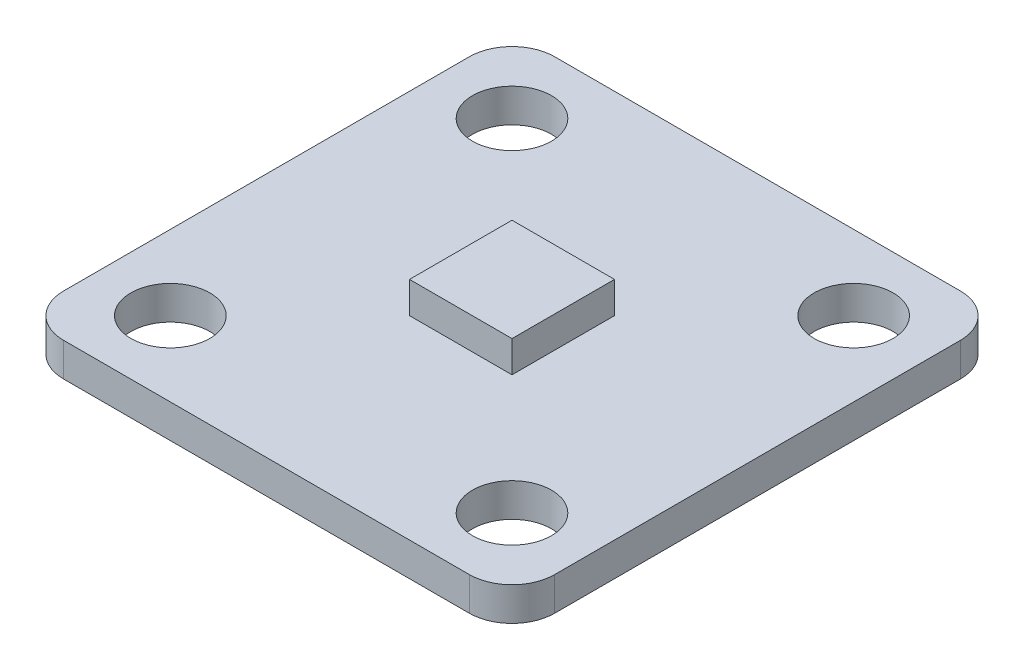
ISO-10303-21;
HEADER;
FILE_DESCRIPTION(('STEP AP214'),'2;1');
FILE_NAME('part.step','',(''),(''),'','','');
FILE_SCHEMA(('AUTOMOTIVE_DESIGN { 1 0 10303 214 1 1 1 1 }'));
ENDSEC;
DATA;
#1=APPLICATION_CONTEXT('core data for automotive mechanical design processes');
#2=APPLICATION_PROTOCOL_DEFINITION('international standard','automotive_design',2000,#1);
#3=PRODUCT_CONTEXT('',#1,'mechanical');
#4=PRODUCT('Part','Part','',(#3));
#5=PRODUCT_RELATED_PRODUCT_CATEGORY('part','',(#4));
#6=PRODUCT_DEFINITION_FORMATION('','',#4);
#7=PRODUCT_DEFINITION_CONTEXT('part definition',#1,'design');
#8=PRODUCT_DEFINITION('design','',#6,#7);
#9=PRODUCT_DEFINITION_SHAPE('','',#8);
#10=(LENGTH_UNIT() NAMED_UNIT(*) SI_UNIT(.MILLI.,.METRE.));
#11=(NAMED_UNIT(*) PLANE_ANGLE_UNIT() SI_UNIT($,.RADIAN.));
#12=(NAMED_UNIT(*) SI_UNIT($,.STERADIAN.) SOLID_ANGLE_UNIT());
#13=UNCERTAINTY_MEASURE_WITH_UNIT(LENGTH_MEASURE(1.E-05),#10,'distance_accuracy_value','');
#14=(GEOMETRIC_REPRESENTATION_CONTEXT(3) GLOBAL_UNCERTAINTY_ASSIGNED_CONTEXT((#13)) GLOBAL_UNIT_ASSIGNED_CONTEXT((#10,
#11,#12)) REPRESENTATION_CONTEXT('',''));
#15=CARTESIAN_POINT('',(0.,0.,0.));
#16=DIRECTION('',(0.,0.,1.));
#17=DIRECTION('',(1.,0.,0.));
#18=AXIS2_PLACEMENT_3D('',#15,#16,#17);
#19=CARTESIAN_POINT('',(0.,1.57,0.));
#20=DIRECTION('',(0.,1.,0.));
#21=DIRECTION('',(0.,0.,1.));
#22=AXIS2_PLACEMENT_3D('',#19,#20,#21);
#23=PLANE('',#22);
#24=CARTESIAN_POINT('',(-8.,1.57,8.));
#25=DIRECTION('',(0.,1.,0.));
#26=DIRECTION('',(0.,0.,1.));
#27=AXIS2_PLACEMENT_3D('',#24,#25,#26);
#28=CIRCLE('',#27,1.85);
#29=CARTESIAN_POINT('',(-8.,1.57,9.85));
#30=VERTEX_POINT('',#29);
#31=EDGE_CURVE('E179',#30,#30,#28,.T.);
#32=ORIENTED_EDGE('',*,*,#31,.F.);
#33=EDGE_LOOP('',(#32));
#34=FACE_BOUND('',#33,.T.);
#35=CARTESIAN_POINT('',(8.,1.57,8.));
#36=DIRECTION('',(0.,1.,0.));
#37=DIRECTION('',(0.,0.,1.));
#38=AXIS2_PLACEMENT_3D('',#35,#36,#37);
#39=CIRCLE('',#38,1.85);
#40=CARTESIAN_POINT('',(8.,1.57,9.85));
#41=VERTEX_POINT('',#40);
#42=EDGE_CURVE('E219',#41,#41,#39,.T.);
#43=ORIENTED_EDGE('',*,*,#42,.F.);
#44=EDGE_LOOP('',(#43));
#45=FACE_BOUND('',#44,.T.);
#46=CARTESIAN_POINT('',(8.,1.57,-8.));
#47=DIRECTION('',(0.,1.,0.));
#48=DIRECTION('',(0.,0.,1.));
#49=AXIS2_PLACEMENT_3D('',#46,#47,#48);
#50=CIRCLE('',#49,1.85);
#51=CARTESIAN_POINT('',(8.,1.57,-6.15));
#52=VERTEX_POINT('',#51);
#53=EDGE_CURVE('E216',#52,#52,#50,.T.);
#54=ORIENTED_EDGE('',*,*,#53,.F.);
#55=EDGE_LOOP('',(#54));
#56=FACE_BOUND('',#55,.T.);
#57=CARTESIAN_POINT('',(-8.,1.57,-8.));
#58=DIRECTION('',(0.,1.,0.));
#59=DIRECTION('',(0.,0.,1.));
#60=AXIS2_PLACEMENT_3D('',#57,#58,#59);
#61=CIRCLE('',#60,1.85);
#62=CARTESIAN_POINT('',(-8.,1.57,-6.15));
#63=VERTEX_POINT('',#62);
#64=EDGE_CURVE('E213',#63,#63,#61,.T.);
#65=ORIENTED_EDGE('',*,*,#64,.F.);
#66=EDGE_LOOP('',(#65));
#67=FACE_BOUND('',#66,.T.);
#68=CARTESIAN_POINT('',(-9.5,1.57,-9.5));
#69=DIRECTION('',(0.,1.,0.));
#70=DIRECTION('',(0.,0.,1.));
#71=AXIS2_PLACEMENT_3D('',#68,#69,#70);
#72=CIRCLE('',#71,2.);
#73=CARTESIAN_POINT('',(-11.5,1.57,-9.49999999999999));
#74=VERTEX_POINT('',#73);
#75=CARTESIAN_POINT('',(-9.49999999999999,1.57,-11.5));
#76=VERTEX_POINT('',#75);
#77=EDGE_CURVE('E209',#74,#76,#72,.F.);
#78=ORIENTED_EDGE('',*,*,#77,.F.);
#79=DIRECTION('',(0.,0.,-1.));
#80=VECTOR('',#79,1.);
#81=CARTESIAN_POINT('',(-11.5,1.57,0.));
#82=LINE('',#81,#80);
#83=CARTESIAN_POINT('',(-11.5,1.57,9.49999999999999));
#84=VERTEX_POINT('',#83);
#85=EDGE_CURVE('E207',#84,#74,#82,.T.);
#86=ORIENTED_EDGE('',*,*,#85,.F.);
#87=CARTESIAN_POINT('',(-9.5,1.57,9.5));
#88=DIRECTION('',(0.,1.,0.));
#89=DIRECTION('',(0.,0.,1.));
#90=AXIS2_PLACEMENT_3D('',#87,#88,#89);
#91=CIRCLE('',#90,2.);
#92=CARTESIAN_POINT('',(-9.49999999999999,1.57,11.5));
#93=VERTEX_POINT('',#92);
#94=EDGE_CURVE('E193',#93,#84,#91,.F.);
#95=ORIENTED_EDGE('',*,*,#94,.F.);
#96=DIRECTION('',(1.,0.,0.));
#97=VECTOR('',#96,1.);
#98=CARTESIAN_POINT('',(0.,1.57,11.5));
#99=LINE('',#98,#97);
#100=CARTESIAN_POINT('',(9.49999999999998,1.57,11.5));
#101=VERTEX_POINT('',#100);
#102=EDGE_CURVE('E205',#93,#101,#99,.T.);
#103=ORIENTED_EDGE('',*,*,#102,.T.);
#104=CARTESIAN_POINT('',(9.5,1.57,9.5));
#105=DIRECTION('',(0.,1.,0.));
#106=DIRECTION('',(0.,0.,1.));
#107=AXIS2_PLACEMENT_3D('',#104,#105,#106);
#108=CIRCLE('',#107,2.);
#109=CARTESIAN_POINT('',(11.5,1.57,9.49999999999999));
#110=VERTEX_POINT('',#109);
#111=EDGE_CURVE('E125',#101,#110,#108,.T.);
#112=ORIENTED_EDGE('',*,*,#111,.T.);
#113=DIRECTION('',(0.,0.,-1.));
#114=VECTOR('',#113,1.);
#115=CARTESIAN_POINT('',(11.5,1.57,0.));
#116=LINE('',#115,#114);
#117=CARTESIAN_POINT('',(11.5,1.57,-9.49999999999999));
#118=VERTEX_POINT('',#117);
#119=EDGE_CURVE('E118',#110,#118,#116,.T.);
#120=ORIENTED_EDGE('',*,*,#119,.T.);
#121=CARTESIAN_POINT('',(9.5,1.57,-9.5));
#122=DIRECTION('',(0.,1.,0.));
#123=DIRECTION('',(0.,0.,1.));
#124=AXIS2_PLACEMENT_3D('',#121,#122,#123);
#125=CIRCLE('',#124,2.);
#126=CARTESIAN_POINT('',(9.49999999999998,1.57,-11.5));
#127=VERTEX_POINT('',#126);
#128=EDGE_CURVE('E123',#127,#118,#125,.F.);
#129=ORIENTED_EDGE('',*,*,#128,.F.);
#130=DIRECTION('',(1.,0.,0.));
#131=VECTOR('',#130,1.);
#132=CARTESIAN_POINT('',(0.,1.57,-11.5));
#133=LINE('',#132,#131);
#134=EDGE_CURVE('E141',#76,#127,#133,.T.);
#135=ORIENTED_EDGE('',*,*,#134,.F.);
#136=EDGE_LOOP('',(#78,#86,#95,#103,#112,#120,#129,#135));
#137=FACE_BOUND('',#136,.T.);
#138=DIRECTION('',(0.,0.,1.));
#139=VECTOR('',#138,1.);
#140=CARTESIAN_POINT('',(-2.4,1.57,0.));
#141=LINE('',#140,#139);
#142=CARTESIAN_POINT('',(-2.4,1.57,-2.4));
#143=VERTEX_POINT('',#142);
#144=CARTESIAN_POINT('',(-2.4,1.57,2.4));
#145=VERTEX_POINT('',#144);
#146=EDGE_CURVE('E239',#143,#145,#141,.T.);
#147=ORIENTED_EDGE('',*,*,#146,.F.);
#148=DIRECTION('',(-1.,0.,0.));
#149=VECTOR('',#148,1.);
#150=CARTESIAN_POINT('',(0.,1.57,-2.4));
#151=LINE('',#150,#149);
#152=CARTESIAN_POINT('',(2.4,1.57,-2.4));
#153=VERTEX_POINT('',#152);
#154=EDGE_CURVE('E242',#153,#143,#151,.T.);
#155=ORIENTED_EDGE('',*,*,#154,.F.);
#156=DIRECTION('',(0.,0.,-1.));
#157=VECTOR('',#156,1.);
#158=CARTESIAN_POINT('',(2.4,1.57,0.));
#159=LINE('',#158,#157);
#160=CARTESIAN_POINT('',(2.4,1.57,2.4));
#161=VERTEX_POINT('',#160);
#162=EDGE_CURVE('E234',#161,#153,#159,.T.);
#163=ORIENTED_EDGE('',*,*,#162,.F.);
#164=DIRECTION('',(1.,0.,0.));
#165=VECTOR('',#164,1.);
#166=CARTESIAN_POINT('',(0.,1.57,2.4));
#167=LINE('',#166,#165);
#168=EDGE_CURVE('E237',#145,#161,#167,.T.);
#169=ORIENTED_EDGE('',*,*,#168,.F.);
#170=EDGE_LOOP('',(#147,#155,#163,#169));
#171=FACE_BOUND('',#170,.T.);
#172=ADVANCED_FACE('F40',(#34,#45,#56,#67,#137,#171),#23,.T.);
#173=CARTESIAN_POINT('',(-9.5,1.57,-9.5));
#174=DIRECTION('',(0.,-1.,0.));
#175=DIRECTION('',(0.,0.,-1.));
#176=AXIS2_PLACEMENT_3D('',#173,#174,#175);
#177=CYLINDRICAL_SURFACE('',#176,2.);
#178=CARTESIAN_POINT('',(-9.5,0.,-9.5));
#179=DIRECTION('',(0.,1.,0.));
#180=DIRECTION('',(0.,0.,1.));
#181=AXIS2_PLACEMENT_3D('',#178,#179,#180);
#182=CIRCLE('',#181,2.);
#183=CARTESIAN_POINT('',(-11.5,0.,-9.49999999999999));
#184=VERTEX_POINT('',#183);
#185=CARTESIAN_POINT('',(-9.49999999999999,0.,-11.5));
#186=VERTEX_POINT('',#185);
#187=EDGE_CURVE('E159',#184,#186,#182,.F.);
#188=ORIENTED_EDGE('',*,*,#187,.F.);
#189=DIRECTION('',(0.,-1.,0.));
#190=VECTOR('',#189,1.);
#191=CARTESIAN_POINT('',(-11.5,1.57,-9.49999999999999));
#192=LINE('',#191,#190);
#193=EDGE_CURVE('E11',#74,#184,#192,.T.);
#194=ORIENTED_EDGE('',*,*,#193,.F.);
#195=ORIENTED_EDGE('',*,*,#77,.T.);
#196=DIRECTION('',(0.,-1.,0.));
#197=VECTOR('',#196,1.);
#198=CARTESIAN_POINT('',(-9.49999999999999,1.57,-11.5));
#199=LINE('',#198,#197);
#200=EDGE_CURVE('E64',#76,#186,#199,.T.);
#201=ORIENTED_EDGE('',*,*,#200,.T.);
#202=EDGE_LOOP('',(#188,#194,#195,#201));
#203=FACE_BOUND('',#202,.T.);
#204=ADVANCED_FACE('F284',(#203),#177,.T.);
#205=CARTESIAN_POINT('',(-11.5,1.57,0.));
#206=DIRECTION('',(-1.,0.,0.));
#207=DIRECTION('',(0.,0.,1.));
#208=AXIS2_PLACEMENT_3D('',#205,#206,#207);
#209=PLANE('',#208);
#210=DIRECTION('',(0.,0.,-1.));
#211=VECTOR('',#210,1.);
#212=CARTESIAN_POINT('',(-11.5,0.,0.));
#213=LINE('',#212,#211);
#214=CARTESIAN_POINT('',(-11.5,0.,9.49999999999999));
#215=VERTEX_POINT('',#214);
#216=EDGE_CURVE('E161',#215,#184,#213,.T.);
#217=ORIENTED_EDGE('',*,*,#216,.F.);
#218=DIRECTION('',(0.,-1.,0.));
#219=VECTOR('',#218,1.);
#220=CARTESIAN_POINT('',(-11.5,1.57,9.49999999999999));
#221=LINE('',#220,#219);
#222=EDGE_CURVE('E48',#84,#215,#221,.T.);
#223=ORIENTED_EDGE('',*,*,#222,.F.);
#224=ORIENTED_EDGE('',*,*,#85,.T.);
#225=ORIENTED_EDGE('',*,*,#193,.T.);
#226=EDGE_LOOP('',(#217,#223,#224,#225));
#227=FACE_BOUND('',#226,.T.);
#228=ADVANCED_FACE('F197',(#227),#209,.T.);
#229=CARTESIAN_POINT('',(-9.5,1.57,9.5));
#230=DIRECTION('',(0.,-1.,0.));
#231=DIRECTION('',(0.,0.,-1.));
#232=AXIS2_PLACEMENT_3D('',#229,#230,#231);
#233=CYLINDRICAL_SURFACE('',#232,2.);
#234=CARTESIAN_POINT('',(-9.5,0.,9.5));
#235=DIRECTION('',(0.,1.,0.));
#236=DIRECTION('',(0.,0.,1.));
#237=AXIS2_PLACEMENT_3D('',#234,#235,#236);
#238=CIRCLE('',#237,2.);
#239=CARTESIAN_POINT('',(-9.49999999999999,0.,11.5));
#240=VERTEX_POINT('',#239);
#241=EDGE_CURVE('E164',#240,#215,#238,.F.);
#242=ORIENTED_EDGE('',*,*,#241,.F.);
#243=DIRECTION('',(0.,-1.,0.));
#244=VECTOR('',#243,1.);
#245=CARTESIAN_POINT('',(-9.49999999999999,1.57,11.5));
#246=LINE('',#245,#244);
#247=EDGE_CURVE('E186',#93,#240,#246,.T.);
#248=ORIENTED_EDGE('',*,*,#247,.F.);
#249=ORIENTED_EDGE('',*,*,#94,.T.);
#250=ORIENTED_EDGE('',*,*,#222,.T.);
#251=EDGE_LOOP('',(#242,#248,#249,#250));
#252=FACE_BOUND('',#251,.T.);
#253=ADVANCED_FACE('F191',(#252),#233,.T.);
#254=CARTESIAN_POINT('',(0.,1.57,11.5));
#255=DIRECTION('',(0.,0.,-1.));
#256=DIRECTION('',(-1.,0.,0.));
#257=AXIS2_PLACEMENT_3D('',#254,#255,#256);
#258=PLANE('',#257);
#259=DIRECTION('',(1.,0.,0.));
#260=VECTOR('',#259,1.);
#261=CARTESIAN_POINT('',(0.,0.,11.5));
#262=LINE('',#261,#260);
#263=CARTESIAN_POINT('',(9.49999999999998,0.,11.5));
#264=VERTEX_POINT('',#263);
#265=EDGE_CURVE('E167',#240,#264,#262,.T.);
#266=ORIENTED_EDGE('',*,*,#265,.T.);
#267=DIRECTION('',(0.,-1.,0.));
#268=VECTOR('',#267,1.);
#269=CARTESIAN_POINT('',(9.49999999999998,1.57,11.5));
#270=LINE('',#269,#268);
#271=EDGE_CURVE('E183',#101,#264,#270,.T.);
#272=ORIENTED_EDGE('',*,*,#271,.F.);
#273=ORIENTED_EDGE('',*,*,#102,.F.);
#274=ORIENTED_EDGE('',*,*,#247,.T.);
#275=EDGE_LOOP('',(#266,#272,#273,#274));
#276=FACE_BOUND('',#275,.T.);
#277=ADVANCED_FACE('F203',(#276),#258,.F.);
#278=CARTESIAN_POINT('',(9.5,1.57,9.5));
#279=DIRECTION('',(0.,-1.,0.));
#280=DIRECTION('',(0.,0.,-1.));
#281=AXIS2_PLACEMENT_3D('',#278,#279,#280);
#282=CYLINDRICAL_SURFACE('',#281,2.);
#283=CARTESIAN_POINT('',(9.5,0.,9.5));
#284=DIRECTION('',(0.,1.,0.));
#285=DIRECTION('',(0.,0.,1.));
#286=AXIS2_PLACEMENT_3D('',#283,#284,#285);
#287=CIRCLE('',#286,2.);
#288=CARTESIAN_POINT('',(11.5,0.,9.49999999999999));
#289=VERTEX_POINT('',#288);
#290=EDGE_CURVE('E170',#264,#289,#287,.T.);
#291=ORIENTED_EDGE('',*,*,#290,.T.);
#292=DIRECTION('',(0.,-1.,0.));
#293=VECTOR('',#292,1.);
#294=CARTESIAN_POINT('',(11.5,1.57,9.49999999999999));
#295=LINE('',#294,#293);
#296=EDGE_CURVE('E137',#110,#289,#295,.T.);
#297=ORIENTED_EDGE('',*,*,#296,.F.);
#298=ORIENTED_EDGE('',*,*,#111,.F.);
#299=ORIENTED_EDGE('',*,*,#271,.T.);
#300=EDGE_LOOP('',(#291,#297,#298,#299));
#301=FACE_BOUND('',#300,.T.);
#302=ADVANCED_FACE('F307',(#301),#282,.T.);
#303=CARTESIAN_POINT('',(11.5,1.57,0.));
#304=DIRECTION('',(-1.,0.,0.));
#305=DIRECTION('',(0.,0.,1.));
#306=AXIS2_PLACEMENT_3D('',#303,#304,#305);
#307=PLANE('',#306);
#308=DIRECTION('',(0.,0.,-1.));
#309=VECTOR('',#308,1.);
#310=CARTESIAN_POINT('',(11.5,0.,0.));
#311=LINE('',#310,#309);
#312=CARTESIAN_POINT('',(11.5,0.,-9.49999999999999));
#313=VERTEX_POINT('',#312);
#314=EDGE_CURVE('E133',#289,#313,#311,.T.);
#315=ORIENTED_EDGE('',*,*,#314,.T.);
#316=DIRECTION('',(0.,-1.,0.));
#317=VECTOR('',#316,1.);
#318=CARTESIAN_POINT('',(11.5,1.57,-9.49999999999999));
#319=LINE('',#318,#317);
#320=EDGE_CURVE('E131',#118,#313,#319,.T.);
#321=ORIENTED_EDGE('',*,*,#320,.F.);
#322=ORIENTED_EDGE('',*,*,#119,.F.);
#323=ORIENTED_EDGE('',*,*,#296,.T.);
#324=EDGE_LOOP('',(#315,#321,#322,#323));
#325=FACE_BOUND('',#324,.T.);
#326=ADVANCED_FACE('F132',(#325),#307,.F.);
#327=CARTESIAN_POINT('',(9.5,1.57,-9.5));
#328=DIRECTION('',(0.,-1.,0.));
#329=DIRECTION('',(0.,0.,-1.));
#330=AXIS2_PLACEMENT_3D('',#327,#328,#329);
#331=CYLINDRICAL_SURFACE('',#330,2.);
#332=CARTESIAN_POINT('',(9.5,0.,-9.5));
#333=DIRECTION('',(0.,1.,0.));
#334=DIRECTION('',(0.,0.,1.));
#335=AXIS2_PLACEMENT_3D('',#332,#333,#334);
#336=CIRCLE('',#335,2.);
#337=CARTESIAN_POINT('',(9.49999999999998,0.,-11.5));
#338=VERTEX_POINT('',#337);
#339=EDGE_CURVE('E174',#338,#313,#336,.F.);
#340=ORIENTED_EDGE('',*,*,#339,.F.);
#341=DIRECTION('',(0.,-1.,0.));
#342=VECTOR('',#341,1.);
#343=CARTESIAN_POINT('',(9.49999999999998,1.57,-11.5));
#344=LINE('',#343,#342);
#345=EDGE_CURVE('E138',#127,#338,#344,.T.);
#346=ORIENTED_EDGE('',*,*,#345,.F.);
#347=ORIENTED_EDGE('',*,*,#128,.T.);
#348=ORIENTED_EDGE('',*,*,#320,.T.);
#349=EDGE_LOOP('',(#340,#346,#347,#348));
#350=FACE_BOUND('',#349,.T.);
#351=ADVANCED_FACE('F140',(#350),#331,.T.);
#352=CARTESIAN_POINT('',(-8.,1.57,-8.));
#353=DIRECTION('',(0.,-1.,0.));
#354=DIRECTION('',(0.,0.,-1.));
#355=AXIS2_PLACEMENT_3D('',#352,#353,#354);
#356=CYLINDRICAL_SURFACE('',#355,1.85);
#357=ORIENTED_EDGE('',*,*,#64,.T.);
#358=EDGE_LOOP('',(#357));
#359=FACE_BOUND('',#358,.T.);
#360=CARTESIAN_POINT('',(-8.,0.,-8.));
#361=DIRECTION('',(0.,1.,0.));
#362=DIRECTION('',(0.,0.,1.));
#363=AXIS2_PLACEMENT_3D('',#360,#361,#362);
#364=CIRCLE('',#363,1.85);
#365=CARTESIAN_POINT('',(-8.,0.,-6.15));
#366=VERTEX_POINT('',#365);
#367=EDGE_CURVE('E156',#366,#366,#364,.T.);
#368=ORIENTED_EDGE('',*,*,#367,.F.);
#369=EDGE_LOOP('',(#368));
#370=FACE_BOUND('',#369,.T.);
#371=ADVANCED_FACE('F304',(#359,#370),#356,.F.);
#372=CARTESIAN_POINT('',(8.,1.57,-8.));
#373=DIRECTION('',(0.,-1.,0.));
#374=DIRECTION('',(0.,0.,-1.));
#375=AXIS2_PLACEMENT_3D('',#372,#373,#374);
#376=CYLINDRICAL_SURFACE('',#375,1.85);
#377=ORIENTED_EDGE('',*,*,#53,.T.);
#378=EDGE_LOOP('',(#377));
#379=FACE_BOUND('',#378,.T.);
#380=CARTESIAN_POINT('',(8.,0.,-8.));
#381=DIRECTION('',(0.,1.,0.));
#382=DIRECTION('',(0.,0.,1.));
#383=AXIS2_PLACEMENT_3D('',#380,#381,#382);
#384=CIRCLE('',#383,1.85);
#385=CARTESIAN_POINT('',(8.,0.,-6.15));
#386=VERTEX_POINT('',#385);
#387=EDGE_CURVE('E153',#386,#386,#384,.T.);
#388=ORIENTED_EDGE('',*,*,#387,.F.);
#389=EDGE_LOOP('',(#388));
#390=FACE_BOUND('',#389,.T.);
#391=ADVANCED_FACE('F319',(#379,#390),#376,.F.);
#392=CARTESIAN_POINT('',(8.,1.57,8.));
#393=DIRECTION('',(0.,-1.,0.));
#394=DIRECTION('',(0.,0.,-1.));
#395=AXIS2_PLACEMENT_3D('',#392,#393,#394);
#396=CYLINDRICAL_SURFACE('',#395,1.85);
#397=ORIENTED_EDGE('',*,*,#42,.T.);
#398=EDGE_LOOP('',(#397));
#399=FACE_BOUND('',#398,.T.);
#400=CARTESIAN_POINT('',(8.,0.,8.));
#401=DIRECTION('',(0.,1.,0.));
#402=DIRECTION('',(0.,0.,1.));
#403=AXIS2_PLACEMENT_3D('',#400,#401,#402);
#404=CIRCLE('',#403,1.85);
#405=CARTESIAN_POINT('',(8.,0.,9.85));
#406=VERTEX_POINT('',#405);
#407=EDGE_CURVE('E149',#406,#406,#404,.T.);
#408=ORIENTED_EDGE('',*,*,#407,.F.);
#409=EDGE_LOOP('',(#408));
#410=FACE_BOUND('',#409,.T.);
#411=ADVANCED_FACE('F322',(#399,#410),#396,.F.);
#412=CARTESIAN_POINT('',(-8.,1.57,8.));
#413=DIRECTION('',(0.,-1.,0.));
#414=DIRECTION('',(0.,0.,-1.));
#415=AXIS2_PLACEMENT_3D('',#412,#413,#414);
#416=CYLINDRICAL_SURFACE('',#415,1.85);
#417=ORIENTED_EDGE('',*,*,#31,.T.);
#418=EDGE_LOOP('',(#417));
#419=FACE_BOUND('',#418,.T.);
#420=CARTESIAN_POINT('',(-8.,0.,8.));
#421=DIRECTION('',(0.,1.,0.));
#422=DIRECTION('',(0.,0.,1.));
#423=AXIS2_PLACEMENT_3D('',#420,#421,#422);
#424=CIRCLE('',#423,1.85);
#425=CARTESIAN_POINT('',(-8.,0.,9.85));
#426=VERTEX_POINT('',#425);
#427=EDGE_CURVE('E146',#426,#426,#424,.T.);
#428=ORIENTED_EDGE('',*,*,#427,.F.);
#429=EDGE_LOOP('',(#428));
#430=FACE_BOUND('',#429,.T.);
#431=ADVANCED_FACE('F42',(#419,#430),#416,.F.);
#432=CARTESIAN_POINT('',(0.,1.57,-11.5));
#433=DIRECTION('',(0.,0.,-1.));
#434=DIRECTION('',(-1.,0.,0.));
#435=AXIS2_PLACEMENT_3D('',#432,#433,#434);
#436=PLANE('',#435);
#437=DIRECTION('',(1.,0.,0.));
#438=VECTOR('',#437,1.);
#439=CARTESIAN_POINT('',(0.,0.,-11.5));
#440=LINE('',#439,#438);
#441=EDGE_CURVE('E176',#186,#338,#440,.T.);
#442=ORIENTED_EDGE('',*,*,#441,.F.);
#443=ORIENTED_EDGE('',*,*,#200,.F.);
#444=ORIENTED_EDGE('',*,*,#134,.T.);
#445=ORIENTED_EDGE('',*,*,#345,.T.);
#446=EDGE_LOOP('',(#442,#443,#444,#445));
#447=FACE_BOUND('',#446,.T.);
#448=ADVANCED_FACE('F298',(#447),#436,.T.);
#449=CARTESIAN_POINT('',(0.,0.,0.));
#450=DIRECTION('',(0.,1.,0.));
#451=DIRECTION('',(0.,0.,1.));
#452=AXIS2_PLACEMENT_3D('',#449,#450,#451);
#453=PLANE('',#452);
#454=ORIENTED_EDGE('',*,*,#427,.T.);
#455=EDGE_LOOP('',(#454));
#456=FACE_BOUND('',#455,.T.);
#457=ORIENTED_EDGE('',*,*,#407,.T.);
#458=EDGE_LOOP('',(#457));
#459=FACE_BOUND('',#458,.T.);
#460=ORIENTED_EDGE('',*,*,#387,.T.);
#461=EDGE_LOOP('',(#460));
#462=FACE_BOUND('',#461,.T.);
#463=ORIENTED_EDGE('',*,*,#367,.T.);
#464=EDGE_LOOP('',(#463));
#465=FACE_BOUND('',#464,.T.);
#466=ORIENTED_EDGE('',*,*,#187,.T.);
#467=ORIENTED_EDGE('',*,*,#441,.T.);
#468=ORIENTED_EDGE('',*,*,#339,.T.);
#469=ORIENTED_EDGE('',*,*,#314,.F.);
#470=ORIENTED_EDGE('',*,*,#290,.F.);
#471=ORIENTED_EDGE('',*,*,#265,.F.);
#472=ORIENTED_EDGE('',*,*,#241,.T.);
#473=ORIENTED_EDGE('',*,*,#216,.T.);
#474=EDGE_LOOP('',(#466,#467,#468,#469,#470,#471,#472,#473));
#475=FACE_BOUND('',#474,.T.);
#476=ADVANCED_FACE('F200',(#456,#459,#462,#465,#475),#453,.F.);
#477=CARTESIAN_POINT('',(0.,3.04,-2.4));
#478=DIRECTION('',(0.,0.,1.));
#479=DIRECTION('',(1.,0.,0.));
#480=AXIS2_PLACEMENT_3D('',#477,#478,#479);
#481=PLANE('',#480);
#482=ORIENTED_EDGE('',*,*,#154,.T.);
#483=DIRECTION('',(0.,-1.,0.));
#484=VECTOR('',#483,1.);
#485=CARTESIAN_POINT('',(-2.4,3.04,-2.4));
#486=LINE('',#485,#484);
#487=CARTESIAN_POINT('',(-2.4,3.04,-2.4));
#488=VERTEX_POINT('',#487);
#489=EDGE_CURVE('E150',#488,#143,#486,.T.);
#490=ORIENTED_EDGE('',*,*,#489,.F.);
#491=DIRECTION('',(-1.,0.,0.));
#492=VECTOR('',#491,1.);
#493=CARTESIAN_POINT('',(0.,3.04,-2.4));
#494=LINE('',#493,#492);
#495=CARTESIAN_POINT('',(2.4,3.04,-2.4));
#496=VERTEX_POINT('',#495);
#497=EDGE_CURVE('E236',#496,#488,#494,.T.);
#498=ORIENTED_EDGE('',*,*,#497,.F.);
#499=DIRECTION('',(0.,-1.,0.));
#500=VECTOR('',#499,1.);
#501=CARTESIAN_POINT('',(2.4,3.04,-2.4));
#502=LINE('',#501,#500);
#503=EDGE_CURVE('E230',#496,#153,#502,.T.);
#504=ORIENTED_EDGE('',*,*,#503,.T.);
#505=EDGE_LOOP('',(#482,#490,#498,#504));
#506=FACE_BOUND('',#505,.T.);
#507=ADVANCED_FACE('F265',(#506),#481,.F.);
#508=CARTESIAN_POINT('',(-2.4,3.04,0.));
#509=DIRECTION('',(1.,0.,0.));
#510=DIRECTION('',(0.,0.,-1.));
#511=AXIS2_PLACEMENT_3D('',#508,#509,#510);
#512=PLANE('',#511);
#513=ORIENTED_EDGE('',*,*,#146,.T.);
#514=DIRECTION('',(0.,-1.,0.));
#515=VECTOR('',#514,1.);
#516=CARTESIAN_POINT('',(-2.4,3.04,2.4));
#517=LINE('',#516,#515);
#518=CARTESIAN_POINT('',(-2.4,3.04,2.4));
#519=VERTEX_POINT('',#518);
#520=EDGE_CURVE('E226',#519,#145,#517,.T.);
#521=ORIENTED_EDGE('',*,*,#520,.F.);
#522=DIRECTION('',(0.,0.,1.));
#523=VECTOR('',#522,1.);
#524=CARTESIAN_POINT('',(-2.4,3.04,0.));
#525=LINE('',#524,#523);
#526=EDGE_CURVE('E250',#488,#519,#525,.T.);
#527=ORIENTED_EDGE('',*,*,#526,.F.);
#528=ORIENTED_EDGE('',*,*,#489,.T.);
#529=EDGE_LOOP('',(#513,#521,#527,#528));
#530=FACE_BOUND('',#529,.T.);
#531=ADVANCED_FACE('F270',(#530),#512,.F.);
#532=CARTESIAN_POINT('',(0.,3.04,2.4));
#533=DIRECTION('',(0.,0.,-1.));
#534=DIRECTION('',(-1.,0.,0.));
#535=AXIS2_PLACEMENT_3D('',#532,#533,#534);
#536=PLANE('',#535);
#537=ORIENTED_EDGE('',*,*,#168,.T.);
#538=DIRECTION('',(0.,-1.,0.));
#539=VECTOR('',#538,1.);
#540=CARTESIAN_POINT('',(2.4,3.04,2.4));
#541=LINE('',#540,#539);
#542=CARTESIAN_POINT('',(2.4,3.04,2.4));
#543=VERTEX_POINT('',#542);
#544=EDGE_CURVE('E55',#543,#161,#541,.T.);
#545=ORIENTED_EDGE('',*,*,#544,.F.);
#546=DIRECTION('',(1.,0.,0.));
#547=VECTOR('',#546,1.);
#548=CARTESIAN_POINT('',(0.,3.04,2.4));
#549=LINE('',#548,#547);
#550=EDGE_CURVE('E247',#519,#543,#549,.T.);
#551=ORIENTED_EDGE('',*,*,#550,.F.);
#552=ORIENTED_EDGE('',*,*,#520,.T.);
#553=EDGE_LOOP('',(#537,#545,#551,#552));
#554=FACE_BOUND('',#553,.T.);
#555=ADVANCED_FACE('F279',(#554),#536,.F.);
#556=CARTESIAN_POINT('',(2.4,3.04,0.));
#557=DIRECTION('',(-1.,0.,0.));
#558=DIRECTION('',(0.,0.,1.));
#559=AXIS2_PLACEMENT_3D('',#556,#557,#558);
#560=PLANE('',#559);
#561=ORIENTED_EDGE('',*,*,#162,.T.);
#562=ORIENTED_EDGE('',*,*,#503,.F.);
#563=DIRECTION('',(0.,0.,-1.));
#564=VECTOR('',#563,1.);
#565=CARTESIAN_POINT('',(2.4,3.04,0.));
#566=LINE('',#565,#564);
#567=EDGE_CURVE('E233',#543,#496,#566,.T.);
#568=ORIENTED_EDGE('',*,*,#567,.F.);
#569=ORIENTED_EDGE('',*,*,#544,.T.);
#570=EDGE_LOOP('',(#561,#562,#568,#569));
#571=FACE_BOUND('',#570,.T.);
#572=ADVANCED_FACE('F282',(#571),#560,.F.);
#573=CARTESIAN_POINT('',(0.,3.04,0.));
#574=DIRECTION('',(0.,1.,0.));
#575=DIRECTION('',(0.,0.,1.));
#576=AXIS2_PLACEMENT_3D('',#573,#574,#575);
#577=PLANE('',#576);
#578=ORIENTED_EDGE('',*,*,#497,.T.);
#579=ORIENTED_EDGE('',*,*,#526,.T.);
#580=ORIENTED_EDGE('',*,*,#550,.T.);
#581=ORIENTED_EDGE('',*,*,#567,.T.);
#582=EDGE_LOOP('',(#578,#579,#580,#581));
#583=FACE_BOUND('',#582,.T.);
#584=ADVANCED_FACE('F258',(#583),#577,.T.);
#585=CLOSED_SHELL('',(#172,#204,#228,#253,#277,#302,#326,#351,#371,#391,#411,#431,#448,#476,
#507,#531,#555,#572,#584));
#586=MANIFOLD_SOLID_BREP('B2',#585);
#587=ADVANCED_BREP_SHAPE_REPRESENTATION('',(#18,#586),#14);
#588=SHAPE_DEFINITION_REPRESENTATION(#9,#587);
ENDSEC;
END-ISO-10303-21;
